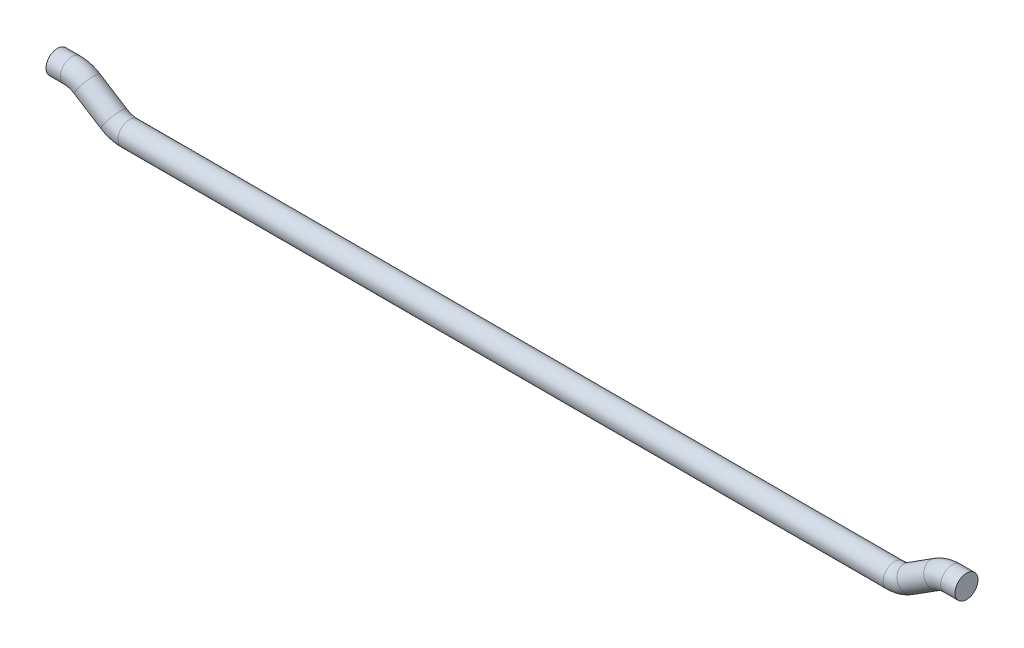
ISO-10303-21;
HEADER;
FILE_DESCRIPTION(('STEP AP214'),'2;1');
FILE_NAME('part.step','',(''),(''),'','','');
FILE_SCHEMA(('AUTOMOTIVE_DESIGN { 1 0 10303 214 1 1 1 1 }'));
ENDSEC;
DATA;
#1=APPLICATION_CONTEXT('core data for automotive mechanical design processes');
#2=APPLICATION_PROTOCOL_DEFINITION('international standard','automotive_design',2000,#1);
#3=PRODUCT_CONTEXT('',#1,'mechanical');
#4=PRODUCT('Part','Part','',(#3));
#5=PRODUCT_RELATED_PRODUCT_CATEGORY('part','',(#4));
#6=PRODUCT_DEFINITION_FORMATION('','',#4);
#7=PRODUCT_DEFINITION_CONTEXT('part definition',#1,'design');
#8=PRODUCT_DEFINITION('design','',#6,#7);
#9=PRODUCT_DEFINITION_SHAPE('','',#8);
#10=(LENGTH_UNIT() NAMED_UNIT(*) SI_UNIT(.MILLI.,.METRE.));
#11=(NAMED_UNIT(*) PLANE_ANGLE_UNIT() SI_UNIT($,.RADIAN.));
#12=(NAMED_UNIT(*) SI_UNIT($,.STERADIAN.) SOLID_ANGLE_UNIT());
#13=UNCERTAINTY_MEASURE_WITH_UNIT(LENGTH_MEASURE(1.E-05),#10,'distance_accuracy_value','');
#14=(GEOMETRIC_REPRESENTATION_CONTEXT(3) GLOBAL_UNCERTAINTY_ASSIGNED_CONTEXT((#13)) GLOBAL_UNIT_ASSIGNED_CONTEXT((#10,
#11,#12)) REPRESENTATION_CONTEXT('',''));
#15=CARTESIAN_POINT('',(0.,0.,0.));
#16=DIRECTION('',(0.,0.,1.));
#17=DIRECTION('',(1.,0.,0.));
#18=AXIS2_PLACEMENT_3D('',#15,#16,#17);
#19=CARTESIAN_POINT('',(62.25,0.,0.));
#20=DIRECTION('',(1.,0.,0.));
#21=DIRECTION('',(0.,1.,0.));
#22=AXIS2_PLACEMENT_3D('',#19,#20,#21);
#23=CYLINDRICAL_SURFACE('',#22,0.8);
#24=CARTESIAN_POINT('',(62.25,0.,0.));
#25=DIRECTION('',(1.,0.,0.));
#26=DIRECTION('',(0.,0.,-1.));
#27=AXIS2_PLACEMENT_3D('',#24,#25,#26);
#28=CIRCLE('',#27,0.8);
#29=CARTESIAN_POINT('',(62.25,0.8,0.));
#30=VERTEX_POINT('',#29);
#31=EDGE_CURVE('E49',#30,#30,#28,.T.);
#32=CARTESIAN_POINT('',(63.25,0.,0.));
#33=DIRECTION('',(1.,0.,0.));
#34=DIRECTION('',(0.,0.,-1.));
#35=AXIS2_PLACEMENT_3D('',#32,#33,#34);
#36=CIRCLE('',#35,0.8);
#37=CARTESIAN_POINT('',(63.25,0.8,0.));
#38=VERTEX_POINT('',#37);
#39=EDGE_CURVE('E12',#38,#38,#36,.T.);
#40=CARTESIAN_POINT('',(62.25,0.8,0.));
#41=CARTESIAN_POINT('',(62.2604166666667,0.8,0.));
#42=CARTESIAN_POINT('',(62.2708333333333,0.8,0.));
#43=CARTESIAN_POINT('',(62.2916666666667,0.8,0.));
#44=CARTESIAN_POINT('',(62.3020833333333,0.8,0.));
#45=CARTESIAN_POINT('',(62.3229166666667,0.8,0.));
#46=CARTESIAN_POINT('',(62.3333333333333,0.8,0.));
#47=CARTESIAN_POINT('',(62.3541666666667,0.8,0.));
#48=CARTESIAN_POINT('',(62.3645833333333,0.8,0.));
#49=CARTESIAN_POINT('',(62.3854166666667,0.8,0.));
#50=CARTESIAN_POINT('',(62.3958333333333,0.8,0.));
#51=CARTESIAN_POINT('',(62.4166666666667,0.8,0.));
#52=CARTESIAN_POINT('',(62.4270833333333,0.8,0.));
#53=CARTESIAN_POINT('',(62.4479166666667,0.8,0.));
#54=CARTESIAN_POINT('',(62.4583333333333,0.8,0.));
#55=CARTESIAN_POINT('',(62.4791666666667,0.8,0.));
#56=CARTESIAN_POINT('',(62.4895833333333,0.8,0.));
#57=CARTESIAN_POINT('',(62.5104166666667,0.8,0.));
#58=CARTESIAN_POINT('',(62.5208333333333,0.8,0.));
#59=CARTESIAN_POINT('',(62.5416666666667,0.8,0.));
#60=CARTESIAN_POINT('',(62.5520833333333,0.8,0.));
#61=CARTESIAN_POINT('',(62.5729166666667,0.8,0.));
#62=CARTESIAN_POINT('',(62.5833333333333,0.8,0.));
#63=CARTESIAN_POINT('',(62.6041666666667,0.8,0.));
#64=CARTESIAN_POINT('',(62.6145833333333,0.8,0.));
#65=CARTESIAN_POINT('',(62.6354166666667,0.8,0.));
#66=CARTESIAN_POINT('',(62.6458333333333,0.8,0.));
#67=CARTESIAN_POINT('',(62.6666666666667,0.8,0.));
#68=CARTESIAN_POINT('',(62.6770833333333,0.8,0.));
#69=CARTESIAN_POINT('',(62.6979166666667,0.8,0.));
#70=CARTESIAN_POINT('',(62.7083333333333,0.8,0.));
#71=CARTESIAN_POINT('',(62.7291666666667,0.8,0.));
#72=CARTESIAN_POINT('',(62.7395833333333,0.8,0.));
#73=CARTESIAN_POINT('',(62.7604166666667,0.8,0.));
#74=CARTESIAN_POINT('',(62.7708333333333,0.8,0.));
#75=CARTESIAN_POINT('',(62.7916666666667,0.8,0.));
#76=CARTESIAN_POINT('',(62.8020833333333,0.8,0.));
#77=CARTESIAN_POINT('',(62.8229166666667,0.8,0.));
#78=CARTESIAN_POINT('',(62.8333333333333,0.8,0.));
#79=CARTESIAN_POINT('',(62.8541666666667,0.8,0.));
#80=CARTESIAN_POINT('',(62.8645833333333,0.8,0.));
#81=CARTESIAN_POINT('',(62.8854166666667,0.8,0.));
#82=CARTESIAN_POINT('',(62.8958333333333,0.8,0.));
#83=CARTESIAN_POINT('',(62.9166666666667,0.8,0.));
#84=CARTESIAN_POINT('',(62.9270833333333,0.8,0.));
#85=CARTESIAN_POINT('',(62.9479166666667,0.8,0.));
#86=CARTESIAN_POINT('',(62.9583333333333,0.8,0.));
#87=CARTESIAN_POINT('',(62.9791666666667,0.8,0.));
#88=CARTESIAN_POINT('',(62.9895833333333,0.8,0.));
#89=CARTESIAN_POINT('',(63.0104166666667,0.8,0.));
#90=CARTESIAN_POINT('',(63.0208333333333,0.8,0.));
#91=CARTESIAN_POINT('',(63.0416666666667,0.8,0.));
#92=CARTESIAN_POINT('',(63.0520833333333,0.8,0.));
#93=CARTESIAN_POINT('',(63.0729166666667,0.8,0.));
#94=CARTESIAN_POINT('',(63.0833333333333,0.8,0.));
#95=CARTESIAN_POINT('',(63.1041666666667,0.8,0.));
#96=CARTESIAN_POINT('',(63.1145833333333,0.8,0.));
#97=CARTESIAN_POINT('',(63.1354166666667,0.8,0.));
#98=CARTESIAN_POINT('',(63.1458333333333,0.8,0.));
#99=CARTESIAN_POINT('',(63.1666666666667,0.8,0.));
#100=CARTESIAN_POINT('',(63.1770833333333,0.8,0.));
#101=CARTESIAN_POINT('',(63.1979166666667,0.8,0.));
#102=CARTESIAN_POINT('',(63.2083333333333,0.8,0.));
#103=CARTESIAN_POINT('',(63.2291666666667,0.8,0.));
#104=CARTESIAN_POINT('',(63.2395833333333,0.8,0.));
#105=CARTESIAN_POINT('',(63.25,0.8,0.));
#106=B_SPLINE_CURVE_WITH_KNOTS('',3,(#40,#41,#42,#43,#44,#45,#46,#47,#48,#49,#50,#51,#52,#53,
#54,#55,#56,#57,#58,#59,#60,#61,#62,#63,#64,#65,#66,#67,#68,#69,#70,#71,#72,#73,#74,#75,#76,#77,
#78,#79,#80,#81,#82,#83,#84,#85,#86,#87,#88,#89,#90,#91,#92,#93,#94,#95,#96,#97,#98,#99,#100,
#101,#102,#103,#104,#105),.UNSPECIFIED.,.F.,.F.,(4,2,2,2,2,2,2,2,2,2,2,2,2,2,2,2,2,2,2,2,2,2,2,
2,2,2,2,2,2,2,2,2,4),(0.,0.0312500000000035,0.0625000000000001,0.0937500000000036,0.125,
0.156250000000004,0.1875,0.218750000000004,0.25,0.281250000000004,0.3125,0.343749999999997,
0.375000000000007,0.406250000000004,0.4375,0.468749999999997,0.500000000000007,
0.531250000000004,0.5625,0.593749999999997,0.625000000000008,0.656250000000004,
0.687500000000001,0.718749999999997,0.750000000000008,0.781250000000004,0.812500000000001,
0.843749999999997,0.875000000000008,0.906250000000004,0.937500000000001,0.968749999999997,
1.00000000000001),.UNSPECIFIED.);
#107=EDGE_CURVE('BSEAM43',#30,#38,#106,.T.);
#108=ORIENTED_EDGE('',*,*,#31,.T.);
#109=ORIENTED_EDGE('',*,*,#39,.F.);
#110=ORIENTED_EDGE('',*,*,#107,.T.);
#111=ORIENTED_EDGE('',*,*,#107,.F.);
#112=EDGE_LOOP('',(#108,#110,#109,#111));
#113=FACE_BOUND('',#112,.T.);
#114=ADVANCED_FACE('F43',(#113),#23,.T.);
#115=CARTESIAN_POINT('',(62.25,-2.,0.));
#116=DIRECTION('',(0.,0.,-1.));
#117=DIRECTION('',(-1.,0.,0.));
#118=AXIS2_PLACEMENT_3D('',#115,#116,#117);
#119=TOROIDAL_SURFACE('',#118,2.,0.8);
#120=CARTESIAN_POINT('',(61.1789827255278,-0.310940499040305,0.));
#121=DIRECTION('',(0.844529750479847,0.535508637236084,0.));
#122=DIRECTION('',(0.,0.,-1.));
#123=AXIS2_PLACEMENT_3D('',#120,#121,#122);
#124=CIRCLE('',#123,0.8);
#125=CARTESIAN_POINT('',(60.750575815739,0.364683301343574,0.));
#126=VERTEX_POINT('',#125);
#127=EDGE_CURVE('E53',#126,#126,#124,.T.);
#128=CARTESIAN_POINT('',(62.25,-2.,0.));
#129=DIRECTION('',(0.,0.,-1.));
#130=DIRECTION('',(-1.,0.,0.));
#131=AXIS2_PLACEMENT_3D('',#128,#129,#130);
#132=CIRCLE('',#131,2.8);
#133=EDGE_CURVE('',#126,#30,#132,.T.);
#134=ORIENTED_EDGE('',*,*,#127,.T.);
#135=ORIENTED_EDGE('',*,*,#31,.F.);
#136=ORIENTED_EDGE('',*,*,#133,.T.);
#137=ORIENTED_EDGE('',*,*,#133,.F.);
#138=EDGE_LOOP('',(#134,#136,#135,#137));
#139=FACE_BOUND('',#138,.T.);
#140=ADVANCED_FACE('F99',(#139),#119,.T.);
#141=CARTESIAN_POINT('',(59.3210172744722,-1.48905950095969,0.));
#142=DIRECTION('',(0.844529750479846,0.535508637236085,0.));
#143=DIRECTION('',(-0.535508637236085,0.844529750479846,0.));
#144=AXIS2_PLACEMENT_3D('',#141,#142,#143);
#145=CYLINDRICAL_SURFACE('',#144,0.8);
#146=CARTESIAN_POINT('',(59.3210172744722,-1.48905950095969,0.));
#147=DIRECTION('',(0.844529750479847,0.535508637236084,0.));
#148=DIRECTION('',(0.,0.,-1.));
#149=AXIS2_PLACEMENT_3D('',#146,#147,#148);
#150=CIRCLE('',#149,0.8);
#151=CARTESIAN_POINT('',(59.749424184261,-2.16468330134357,0.));
#152=VERTEX_POINT('',#151);
#153=EDGE_CURVE('E57',#152,#152,#150,.T.);
#154=ORIENTED_EDGE('',*,*,#153,.T.);
#155=EDGE_LOOP('',(#154));
#156=FACE_BOUND('',#155,.T.);
#157=ORIENTED_EDGE('',*,*,#127,.F.);
#158=EDGE_LOOP('',(#157));
#159=FACE_BOUND('',#158,.T.);
#160=ADVANCED_FACE('F103',(#156,#159),#145,.T.);
#161=CARTESIAN_POINT('',(58.25,0.2,0.));
#162=DIRECTION('',(0.,0.,1.));
#163=DIRECTION('',(1.,0.,0.));
#164=AXIS2_PLACEMENT_3D('',#161,#162,#163);
#165=TOROIDAL_SURFACE('',#164,2.,0.8);
#166=CARTESIAN_POINT('',(58.25,-1.8,0.));
#167=DIRECTION('',(1.,0.,0.));
#168=DIRECTION('',(0.,0.,-1.));
#169=AXIS2_PLACEMENT_3D('',#166,#167,#168);
#170=CIRCLE('',#169,0.8);
#171=CARTESIAN_POINT('',(58.25,-2.6,0.));
#172=VERTEX_POINT('',#171);
#173=EDGE_CURVE('E62',#172,#172,#170,.T.);
#174=CARTESIAN_POINT('',(58.25,0.2,0.));
#175=DIRECTION('',(0.,0.,1.));
#176=DIRECTION('',(1.,0.,0.));
#177=AXIS2_PLACEMENT_3D('',#174,#175,#176);
#178=CIRCLE('',#177,2.8);
#179=EDGE_CURVE('',#172,#152,#178,.T.);
#180=ORIENTED_EDGE('',*,*,#173,.T.);
#181=ORIENTED_EDGE('',*,*,#153,.F.);
#182=ORIENTED_EDGE('',*,*,#179,.T.);
#183=ORIENTED_EDGE('',*,*,#179,.F.);
#184=EDGE_LOOP('',(#180,#182,#181,#183));
#185=FACE_BOUND('',#184,.T.);
#186=ADVANCED_FACE('F109',(#185),#165,.T.);
#187=CARTESIAN_POINT('',(5.,-1.8,0.));
#188=DIRECTION('',(1.,0.,0.));
#189=DIRECTION('',(0.,1.,0.));
#190=AXIS2_PLACEMENT_3D('',#187,#188,#189);
#191=CYLINDRICAL_SURFACE('',#190,0.8);
#192=CARTESIAN_POINT('',(5.,-1.8,0.));
#193=DIRECTION('',(1.,0.,0.));
#194=DIRECTION('',(0.,0.,-1.));
#195=AXIS2_PLACEMENT_3D('',#192,#193,#194);
#196=CIRCLE('',#195,0.8);
#197=CARTESIAN_POINT('',(5.,-2.6,0.));
#198=VERTEX_POINT('',#197);
#199=EDGE_CURVE('E65',#198,#198,#196,.T.);
#200=ORIENTED_EDGE('',*,*,#199,.T.);
#201=EDGE_LOOP('',(#200));
#202=FACE_BOUND('',#201,.T.);
#203=ORIENTED_EDGE('',*,*,#173,.F.);
#204=EDGE_LOOP('',(#203));
#205=FACE_BOUND('',#204,.T.);
#206=ADVANCED_FACE('F116',(#202,#205),#191,.T.);
#207=CARTESIAN_POINT('',(5.,0.2,0.));
#208=DIRECTION('',(0.,0.,1.));
#209=DIRECTION('',(1.,0.,0.));
#210=AXIS2_PLACEMENT_3D('',#207,#208,#209);
#211=TOROIDAL_SURFACE('',#210,2.,0.8);
#212=CARTESIAN_POINT('',(3.92898272552783,-1.48905950095969,0.));
#213=DIRECTION('',(0.844529750479847,-0.535508637236084,0.));
#214=DIRECTION('',(0.,0.,-1.));
#215=AXIS2_PLACEMENT_3D('',#212,#213,#214);
#216=CIRCLE('',#215,0.8);
#217=CARTESIAN_POINT('',(3.50057581573896,-2.16468330134357,0.));
#218=VERTEX_POINT('',#217);
#219=EDGE_CURVE('E68',#218,#218,#216,.T.);
#220=CARTESIAN_POINT('',(5.,0.2,0.));
#221=DIRECTION('',(0.,0.,1.));
#222=DIRECTION('',(1.,0.,0.));
#223=AXIS2_PLACEMENT_3D('',#220,#221,#222);
#224=CIRCLE('',#223,2.8);
#225=EDGE_CURVE('',#218,#198,#224,.T.);
#226=ORIENTED_EDGE('',*,*,#219,.T.);
#227=ORIENTED_EDGE('',*,*,#199,.F.);
#228=ORIENTED_EDGE('',*,*,#225,.T.);
#229=ORIENTED_EDGE('',*,*,#225,.F.);
#230=EDGE_LOOP('',(#226,#228,#227,#229));
#231=FACE_BOUND('',#230,.T.);
#232=ADVANCED_FACE('F120',(#231),#211,.T.);
#233=CARTESIAN_POINT('',(2.07101727447217,-0.310940499040307,0.));
#234=DIRECTION('',(0.844529750479846,-0.535508637236085,0.));
#235=DIRECTION('',(0.535508637236085,0.844529750479846,0.));
#236=AXIS2_PLACEMENT_3D('',#233,#234,#235);
#237=CYLINDRICAL_SURFACE('',#236,0.8);
#238=CARTESIAN_POINT('',(2.07101727447217,-0.310940499040307,0.));
#239=DIRECTION('',(0.844529750479847,-0.535508637236084,0.));
#240=DIRECTION('',(0.,0.,-1.));
#241=AXIS2_PLACEMENT_3D('',#238,#239,#240);
#242=CIRCLE('',#241,0.8);
#243=CARTESIAN_POINT('',(2.49942418426104,0.364683301343571,0.));
#244=VERTEX_POINT('',#243);
#245=EDGE_CURVE('E71',#244,#244,#242,.T.);
#246=ORIENTED_EDGE('',*,*,#245,.T.);
#247=EDGE_LOOP('',(#246));
#248=FACE_BOUND('',#247,.T.);
#249=ORIENTED_EDGE('',*,*,#219,.F.);
#250=EDGE_LOOP('',(#249));
#251=FACE_BOUND('',#250,.T.);
#252=ADVANCED_FACE('F124',(#248,#251),#237,.T.);
#253=CARTESIAN_POINT('',(1.,-2.,0.));
#254=DIRECTION('',(0.,0.,-1.));
#255=DIRECTION('',(-1.,0.,0.));
#256=AXIS2_PLACEMENT_3D('',#253,#254,#255);
#257=TOROIDAL_SURFACE('',#256,2.,0.8);
#258=CARTESIAN_POINT('',(1.,0.,0.));
#259=DIRECTION('',(1.,0.,0.));
#260=DIRECTION('',(0.,0.,-1.));
#261=AXIS2_PLACEMENT_3D('',#258,#259,#260);
#262=CIRCLE('',#261,0.8);
#263=CARTESIAN_POINT('',(1.,0.8,0.));
#264=VERTEX_POINT('',#263);
#265=EDGE_CURVE('E74',#264,#264,#262,.T.);
#266=CARTESIAN_POINT('',(1.,-2.,0.));
#267=DIRECTION('',(0.,0.,-1.));
#268=DIRECTION('',(-1.,0.,0.));
#269=AXIS2_PLACEMENT_3D('',#266,#267,#268);
#270=CIRCLE('',#269,2.8);
#271=EDGE_CURVE('',#264,#244,#270,.T.);
#272=ORIENTED_EDGE('',*,*,#265,.T.);
#273=ORIENTED_EDGE('',*,*,#245,.F.);
#274=ORIENTED_EDGE('',*,*,#271,.T.);
#275=ORIENTED_EDGE('',*,*,#271,.F.);
#276=EDGE_LOOP('',(#272,#274,#273,#275));
#277=FACE_BOUND('',#276,.T.);
#278=ADVANCED_FACE('F81',(#277),#257,.T.);
#279=CARTESIAN_POINT('',(1.,0.,0.));
#280=DIRECTION('',(-1.,0.,0.));
#281=DIRECTION('',(0.,0.,1.));
#282=AXIS2_PLACEMENT_3D('',#279,#280,#281);
#283=CYLINDRICAL_SURFACE('',#282,0.8);
#284=ORIENTED_EDGE('',*,*,#265,.F.);
#285=EDGE_LOOP('',(#284));
#286=FACE_BOUND('',#285,.T.);
#287=CARTESIAN_POINT('',(0.,0.,0.));
#288=DIRECTION('',(1.,0.,0.));
#289=DIRECTION('',(0.,0.,-1.));
#290=AXIS2_PLACEMENT_3D('',#287,#288,#289);
#291=CIRCLE('',#290,0.8);
#292=CARTESIAN_POINT('',(0.,0.,-0.8));
#293=VERTEX_POINT('',#292);
#294=EDGE_CURVE('E75',#293,#293,#291,.T.);
#295=ORIENTED_EDGE('',*,*,#294,.T.);
#296=EDGE_LOOP('',(#295));
#297=FACE_BOUND('',#296,.T.);
#298=ADVANCED_FACE('F84',(#286,#297),#283,.T.);
#299=CARTESIAN_POINT('',(63.25,0.,0.));
#300=DIRECTION('',(1.,0.,0.));
#301=DIRECTION('',(0.,0.,-1.));
#302=AXIS2_PLACEMENT_3D('',#299,#300,#301);
#303=PLANE('',#302);
#304=ORIENTED_EDGE('',*,*,#39,.T.);
#305=EDGE_LOOP('',(#304));
#306=FACE_BOUND('',#305,.T.);
#307=ADVANCED_FACE('F87',(#306),#303,.T.);
#308=CARTESIAN_POINT('',(0.,0.,0.));
#309=DIRECTION('',(1.,0.,0.));
#310=DIRECTION('',(0.,0.,-1.));
#311=AXIS2_PLACEMENT_3D('',#308,#309,#310);
#312=PLANE('',#311);
#313=ORIENTED_EDGE('',*,*,#294,.F.);
#314=EDGE_LOOP('',(#313));
#315=FACE_BOUND('',#314,.T.);
#316=ADVANCED_FACE('F91',(#315),#312,.F.);
#317=CLOSED_SHELL('',(#114,#140,#160,#186,#206,#232,#252,#278,#298,#307,#316));
#318=MANIFOLD_SOLID_BREP('B2',#317);
#319=ADVANCED_BREP_SHAPE_REPRESENTATION('',(#18,#318),#14);
#320=SHAPE_DEFINITION_REPRESENTATION(#9,#319);
ENDSEC;
END-ISO-10303-21;
